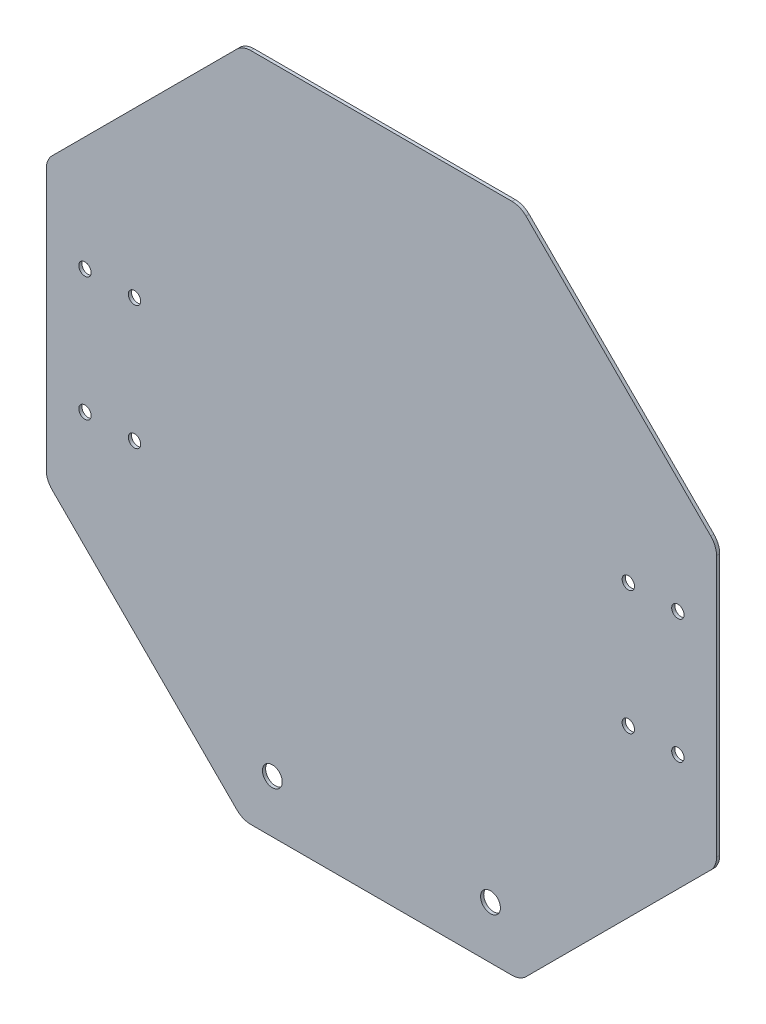
ISO-10303-21;
HEADER;
FILE_DESCRIPTION(('STEP AP214'),'2;1');
FILE_NAME('part.step','',(''),(''),'','','');
FILE_SCHEMA(('AUTOMOTIVE_DESIGN { 1 0 10303 214 1 1 1 1 }'));
ENDSEC;
DATA;
#1=APPLICATION_CONTEXT('core data for automotive mechanical design processes');
#2=APPLICATION_PROTOCOL_DEFINITION('international standard','automotive_design',2000,#1);
#3=PRODUCT_CONTEXT('',#1,'mechanical');
#4=PRODUCT('Part','Part','',(#3));
#5=PRODUCT_RELATED_PRODUCT_CATEGORY('part','',(#4));
#6=PRODUCT_DEFINITION_FORMATION('','',#4);
#7=PRODUCT_DEFINITION_CONTEXT('part definition',#1,'design');
#8=PRODUCT_DEFINITION('design','',#6,#7);
#9=PRODUCT_DEFINITION_SHAPE('','',#8);
#10=(LENGTH_UNIT() NAMED_UNIT(*) SI_UNIT(.MILLI.,.METRE.));
#11=(NAMED_UNIT(*) PLANE_ANGLE_UNIT() SI_UNIT($,.RADIAN.));
#12=(NAMED_UNIT(*) SI_UNIT($,.STERADIAN.) SOLID_ANGLE_UNIT());
#13=UNCERTAINTY_MEASURE_WITH_UNIT(LENGTH_MEASURE(1.E-05),#10,'distance_accuracy_value','');
#14=(GEOMETRIC_REPRESENTATION_CONTEXT(3) GLOBAL_UNCERTAINTY_ASSIGNED_CONTEXT((#13)) GLOBAL_UNIT_ASSIGNED_CONTEXT((#10,
#11,#12)) REPRESENTATION_CONTEXT('',''));
#15=CARTESIAN_POINT('',(0.,0.,0.));
#16=DIRECTION('',(0.,0.,1.));
#17=DIRECTION('',(1.,0.,0.));
#18=AXIS2_PLACEMENT_3D('',#15,#16,#17);
#19=CARTESIAN_POINT('',(96.8284371247499,78.2010199999873,0.36576));
#20=DIRECTION('',(0.,0.,-1.));
#21=DIRECTION('',(-1.,0.,0.));
#22=AXIS2_PLACEMENT_3D('',#19,#20,#21);
#23=CYLINDRICAL_SURFACE('',#22,2.);
#24=CARTESIAN_POINT('',(96.8284371247499,78.2010199999873,0.04572));
#25=DIRECTION('',(0.,0.,1.));
#26=DIRECTION('',(-1.,0.,0.));
#27=AXIS2_PLACEMENT_3D('',#24,#25,#26);
#28=CIRCLE('',#27,2.);
#29=CARTESIAN_POINT('',(95.41422,76.78681,0.04572));
#30=VERTEX_POINT('',#29);
#31=CARTESIAN_POINT('',(96.82843,76.20102,0.04572));
#32=VERTEX_POINT('',#31);
#33=EDGE_CURVE('E195',#30,#32,#28,.T.);
#34=ORIENTED_EDGE('',*,*,#33,.T.);
#35=DIRECTION('',(0.,0.,-1.));
#36=VECTOR('',#35,1.);
#37=CARTESIAN_POINT('',(96.82843,76.20102,0.36576));
#38=LINE('',#37,#36);
#39=CARTESIAN_POINT('',(96.82843,76.20102,0.36576));
#40=VERTEX_POINT('',#39);
#41=EDGE_CURVE('E11',#40,#32,#38,.T.);
#42=ORIENTED_EDGE('',*,*,#41,.F.);
#43=CARTESIAN_POINT('',(96.8284371247499,78.2010199999873,0.36576));
#44=DIRECTION('',(0.,0.,1.));
#45=DIRECTION('',(-1.,0.,0.));
#46=AXIS2_PLACEMENT_3D('',#43,#44,#45);
#47=CIRCLE('',#46,2.);
#48=CARTESIAN_POINT('',(95.41422,76.78681,0.36576));
#49=VERTEX_POINT('',#48);
#50=EDGE_CURVE('E242',#49,#40,#47,.T.);
#51=ORIENTED_EDGE('',*,*,#50,.F.);
#52=DIRECTION('',(0.,0.,-1.));
#53=VECTOR('',#52,1.);
#54=CARTESIAN_POINT('',(95.41422,76.78681,0.36576));
#55=LINE('',#54,#53);
#56=EDGE_CURVE('E191',#49,#30,#55,.T.);
#57=ORIENTED_EDGE('',*,*,#56,.T.);
#58=EDGE_LOOP('',(#34,#42,#51,#57));
#59=FACE_BOUND('',#58,.T.);
#60=ADVANCED_FACE('F46',(#59),#23,.T.);
#61=CARTESIAN_POINT('',(123.17158,76.20102,0.36576));
#62=DIRECTION('',(0.,1.,0.));
#63=DIRECTION('',(0.,0.,1.));
#64=AXIS2_PLACEMENT_3D('',#61,#62,#63);
#65=PLANE('',#64);
#66=DIRECTION('',(1.,0.,0.));
#67=VECTOR('',#66,1.);
#68=CARTESIAN_POINT('',(123.17158,76.20102,0.04572));
#69=LINE('',#68,#67);
#70=CARTESIAN_POINT('',(123.17158,76.20102,0.04572));
#71=VERTEX_POINT('',#70);
#72=EDGE_CURVE('E199',#32,#71,#69,.T.);
#73=ORIENTED_EDGE('',*,*,#72,.T.);
#74=DIRECTION('',(0.,0.,-1.));
#75=VECTOR('',#74,1.);
#76=CARTESIAN_POINT('',(123.17158,76.20102,0.36576));
#77=LINE('',#76,#75);
#78=CARTESIAN_POINT('',(123.17158,76.20102,0.36576));
#79=VERTEX_POINT('',#78);
#80=EDGE_CURVE('E55',#79,#71,#77,.T.);
#81=ORIENTED_EDGE('',*,*,#80,.F.);
#82=DIRECTION('',(1.,0.,0.));
#83=VECTOR('',#82,1.);
#84=CARTESIAN_POINT('',(123.17158,76.20102,0.36576));
#85=LINE('',#84,#83);
#86=EDGE_CURVE('E130',#40,#79,#85,.T.);
#87=ORIENTED_EDGE('',*,*,#86,.F.);
#88=ORIENTED_EDGE('',*,*,#41,.T.);
#89=EDGE_LOOP('',(#73,#81,#87,#88));
#90=FACE_BOUND('',#89,.T.);
#91=ADVANCED_FACE('F365',(#90),#65,.F.);
#92=CARTESIAN_POINT('',(123.171582875261,78.2010199999979,0.36576));
#93=DIRECTION('',(0.,0.,-1.));
#94=DIRECTION('',(-1.,0.,0.));
#95=AXIS2_PLACEMENT_3D('',#92,#93,#94);
#96=CYLINDRICAL_SURFACE('',#95,2.);
#97=CARTESIAN_POINT('',(123.171582875261,78.2010199999979,0.04572));
#98=DIRECTION('',(0.,0.,1.));
#99=DIRECTION('',(-1.,0.,0.));
#100=AXIS2_PLACEMENT_3D('',#97,#98,#99);
#101=CIRCLE('',#100,2.);
#102=CARTESIAN_POINT('',(124.5858,76.78681,0.04572));
#103=VERTEX_POINT('',#102);
#104=EDGE_CURVE('E203',#71,#103,#101,.T.);
#105=ORIENTED_EDGE('',*,*,#104,.T.);
#106=DIRECTION('',(0.,0.,-1.));
#107=VECTOR('',#106,1.);
#108=CARTESIAN_POINT('',(124.5858,76.78681,0.36576));
#109=LINE('',#108,#107);
#110=CARTESIAN_POINT('',(124.5858,76.78681,0.36576));
#111=VERTEX_POINT('',#110);
#112=EDGE_CURVE('E285',#111,#103,#109,.T.);
#113=ORIENTED_EDGE('',*,*,#112,.F.);
#114=CARTESIAN_POINT('',(123.171582875261,78.2010199999979,0.36576));
#115=DIRECTION('',(0.,0.,1.));
#116=DIRECTION('',(-1.,0.,0.));
#117=AXIS2_PLACEMENT_3D('',#114,#115,#116);
#118=CIRCLE('',#117,2.);
#119=EDGE_CURVE('E295',#79,#111,#118,.T.);
#120=ORIENTED_EDGE('',*,*,#119,.F.);
#121=ORIENTED_EDGE('',*,*,#80,.T.);
#122=EDGE_LOOP('',(#105,#113,#120,#121));
#123=FACE_BOUND('',#122,.T.);
#124=ADVANCED_FACE('F293',(#123),#96,.T.);
#125=CARTESIAN_POINT('',(143.21321,95.41422,0.36576));
#126=DIRECTION('',(-0.707106781186547,0.707106781186547,0.));
#127=DIRECTION('',(-0.707106781186548,-0.707106781186548,0.));
#128=AXIS2_PLACEMENT_3D('',#125,#126,#127);
#129=PLANE('',#128);
#130=DIRECTION('',(0.707106781186547,0.707106781186547,0.));
#131=VECTOR('',#130,1.);
#132=CARTESIAN_POINT('',(143.21321,95.41422,0.04572));
#133=LINE('',#132,#131);
#134=CARTESIAN_POINT('',(143.21321,95.41422,0.04572));
#135=VERTEX_POINT('',#134);
#136=EDGE_CURVE('E206',#103,#135,#133,.T.);
#137=ORIENTED_EDGE('',*,*,#136,.T.);
#138=DIRECTION('',(0.,0.,-1.));
#139=VECTOR('',#138,1.);
#140=CARTESIAN_POINT('',(143.21321,95.41422,0.36576));
#141=LINE('',#140,#139);
#142=CARTESIAN_POINT('',(143.21321,95.41422,0.36576));
#143=VERTEX_POINT('',#142);
#144=EDGE_CURVE('E281',#143,#135,#141,.T.);
#145=ORIENTED_EDGE('',*,*,#144,.F.);
#146=DIRECTION('',(0.707106781186547,0.707106781186547,0.));
#147=VECTOR('',#146,1.);
#148=CARTESIAN_POINT('',(143.21321,95.41422,0.36576));
#149=LINE('',#148,#147);
#150=EDGE_CURVE('E314',#111,#143,#149,.T.);
#151=ORIENTED_EDGE('',*,*,#150,.F.);
#152=ORIENTED_EDGE('',*,*,#112,.T.);
#153=EDGE_LOOP('',(#137,#145,#151,#152));
#154=FACE_BOUND('',#153,.T.);
#155=ADVANCED_FACE('F304',(#154),#129,.F.);
#156=CARTESIAN_POINT('',(141.799000000013,96.8284371247499,0.36576));
#157=DIRECTION('',(0.,0.,-1.));
#158=DIRECTION('',(-1.,0.,0.));
#159=AXIS2_PLACEMENT_3D('',#156,#157,#158);
#160=CYLINDRICAL_SURFACE('',#159,2.00000000000001);
#161=CARTESIAN_POINT('',(141.799000000013,96.8284371247499,0.04572));
#162=DIRECTION('',(0.,0.,1.));
#163=DIRECTION('',(-1.,0.,0.));
#164=AXIS2_PLACEMENT_3D('',#161,#162,#163);
#165=CIRCLE('',#164,2.00000000000001);
#166=CARTESIAN_POINT('',(143.799,96.82843,0.04572));
#167=VERTEX_POINT('',#166);
#168=EDGE_CURVE('E209',#135,#167,#165,.T.);
#169=ORIENTED_EDGE('',*,*,#168,.T.);
#170=DIRECTION('',(0.,0.,-1.));
#171=VECTOR('',#170,1.);
#172=CARTESIAN_POINT('',(143.799,96.82843,0.36576));
#173=LINE('',#172,#171);
#174=CARTESIAN_POINT('',(143.799,96.82843,0.36576));
#175=VERTEX_POINT('',#174);
#176=EDGE_CURVE('E277',#175,#167,#173,.T.);
#177=ORIENTED_EDGE('',*,*,#176,.F.);
#178=CARTESIAN_POINT('',(141.799000000013,96.8284371247499,0.36576));
#179=DIRECTION('',(0.,0.,1.));
#180=DIRECTION('',(-1.,0.,0.));
#181=AXIS2_PLACEMENT_3D('',#178,#179,#180);
#182=CIRCLE('',#181,2.00000000000001);
#183=EDGE_CURVE('E310',#143,#175,#182,.T.);
#184=ORIENTED_EDGE('',*,*,#183,.F.);
#185=ORIENTED_EDGE('',*,*,#144,.T.);
#186=EDGE_LOOP('',(#169,#177,#184,#185));
#187=FACE_BOUND('',#186,.T.);
#188=ADVANCED_FACE('F308',(#187),#160,.T.);
#189=CARTESIAN_POINT('',(143.799,123.17158,0.36576));
#190=DIRECTION('',(-1.,0.,0.));
#191=DIRECTION('',(0.,0.,1.));
#192=AXIS2_PLACEMENT_3D('',#189,#190,#191);
#193=PLANE('',#192);
#194=DIRECTION('',(0.,1.,0.));
#195=VECTOR('',#194,1.);
#196=CARTESIAN_POINT('',(143.799,123.17158,0.04572));
#197=LINE('',#196,#195);
#198=CARTESIAN_POINT('',(143.799,123.17158,0.04572));
#199=VERTEX_POINT('',#198);
#200=EDGE_CURVE('E212',#167,#199,#197,.T.);
#201=ORIENTED_EDGE('',*,*,#200,.T.);
#202=DIRECTION('',(0.,0.,-1.));
#203=VECTOR('',#202,1.);
#204=CARTESIAN_POINT('',(143.799,123.17158,0.36576));
#205=LINE('',#204,#203);
#206=CARTESIAN_POINT('',(143.799,123.17158,0.36576));
#207=VERTEX_POINT('',#206);
#208=EDGE_CURVE('E273',#207,#199,#205,.T.);
#209=ORIENTED_EDGE('',*,*,#208,.F.);
#210=DIRECTION('',(0.,1.,0.));
#211=VECTOR('',#210,1.);
#212=CARTESIAN_POINT('',(143.799,123.17158,0.36576));
#213=LINE('',#212,#211);
#214=EDGE_CURVE('E313',#175,#207,#213,.T.);
#215=ORIENTED_EDGE('',*,*,#214,.F.);
#216=ORIENTED_EDGE('',*,*,#176,.T.);
#217=EDGE_LOOP('',(#201,#209,#215,#216));
#218=FACE_BOUND('',#217,.T.);
#219=ADVANCED_FACE('F378',(#218),#193,.F.);
#220=CARTESIAN_POINT('',(141.799000000002,123.171582875261,0.36576));
#221=DIRECTION('',(0.,0.,-1.));
#222=DIRECTION('',(-1.,0.,0.));
#223=AXIS2_PLACEMENT_3D('',#220,#221,#222);
#224=CYLINDRICAL_SURFACE('',#223,2.00000000000001);
#225=CARTESIAN_POINT('',(141.799000000002,123.171582875261,0.04572));
#226=DIRECTION('',(0.,0.,1.));
#227=DIRECTION('',(-1.,0.,0.));
#228=AXIS2_PLACEMENT_3D('',#225,#226,#227);
#229=CIRCLE('',#228,2.00000000000001);
#230=CARTESIAN_POINT('',(143.21321,124.5858,0.04572));
#231=VERTEX_POINT('',#230);
#232=EDGE_CURVE('E215',#199,#231,#229,.T.);
#233=ORIENTED_EDGE('',*,*,#232,.T.);
#234=DIRECTION('',(0.,0.,-1.));
#235=VECTOR('',#234,1.);
#236=CARTESIAN_POINT('',(143.21321,124.5858,0.36576));
#237=LINE('',#236,#235);
#238=CARTESIAN_POINT('',(143.21321,124.5858,0.36576));
#239=VERTEX_POINT('',#238);
#240=EDGE_CURVE('E269',#239,#231,#237,.T.);
#241=ORIENTED_EDGE('',*,*,#240,.F.);
#242=CARTESIAN_POINT('',(141.799000000002,123.171582875261,0.36576));
#243=DIRECTION('',(0.,0.,1.));
#244=DIRECTION('',(-1.,0.,0.));
#245=AXIS2_PLACEMENT_3D('',#242,#243,#244);
#246=CIRCLE('',#245,2.00000000000001);
#247=EDGE_CURVE('E318',#207,#239,#246,.T.);
#248=ORIENTED_EDGE('',*,*,#247,.F.);
#249=ORIENTED_EDGE('',*,*,#208,.T.);
#250=EDGE_LOOP('',(#233,#241,#248,#249));
#251=FACE_BOUND('',#250,.T.);
#252=ADVANCED_FACE('F381',(#251),#224,.T.);
#253=CARTESIAN_POINT('',(124.5858,143.21321,0.36576));
#254=DIRECTION('',(-0.707106781186547,-0.707106781186547,0.));
#255=DIRECTION('',(0.707106781186548,-0.707106781186548,0.));
#256=AXIS2_PLACEMENT_3D('',#253,#254,#255);
#257=PLANE('',#256);
#258=DIRECTION('',(-0.707106781186547,0.707106781186547,0.));
#259=VECTOR('',#258,1.);
#260=CARTESIAN_POINT('',(124.5858,143.21321,0.04572));
#261=LINE('',#260,#259);
#262=CARTESIAN_POINT('',(124.5858,143.21321,0.04572));
#263=VERTEX_POINT('',#262);
#264=EDGE_CURVE('E218',#231,#263,#261,.T.);
#265=ORIENTED_EDGE('',*,*,#264,.T.);
#266=DIRECTION('',(0.,0.,-1.));
#267=VECTOR('',#266,1.);
#268=CARTESIAN_POINT('',(124.5858,143.21321,0.36576));
#269=LINE('',#268,#267);
#270=CARTESIAN_POINT('',(124.5858,143.21321,0.36576));
#271=VERTEX_POINT('',#270);
#272=EDGE_CURVE('E265',#271,#263,#269,.T.);
#273=ORIENTED_EDGE('',*,*,#272,.F.);
#274=DIRECTION('',(-0.707106781186547,0.707106781186547,0.));
#275=VECTOR('',#274,1.);
#276=CARTESIAN_POINT('',(124.5858,143.21321,0.36576));
#277=LINE('',#276,#275);
#278=EDGE_CURVE('E325',#239,#271,#277,.T.);
#279=ORIENTED_EDGE('',*,*,#278,.F.);
#280=ORIENTED_EDGE('',*,*,#240,.T.);
#281=EDGE_LOOP('',(#265,#273,#279,#280));
#282=FACE_BOUND('',#281,.T.);
#283=ADVANCED_FACE('F385',(#282),#257,.F.);
#284=CARTESIAN_POINT('',(123.171582875261,141.799000000002,0.36576));
#285=DIRECTION('',(0.,0.,-1.));
#286=DIRECTION('',(-1.,0.,0.));
#287=AXIS2_PLACEMENT_3D('',#284,#285,#286);
#288=CYLINDRICAL_SURFACE('',#287,2.00000000000001);
#289=CARTESIAN_POINT('',(123.171582875261,141.799000000002,0.04572));
#290=DIRECTION('',(0.,0.,1.));
#291=DIRECTION('',(-1.,0.,0.));
#292=AXIS2_PLACEMENT_3D('',#289,#290,#291);
#293=CIRCLE('',#292,2.00000000000001);
#294=CARTESIAN_POINT('',(123.17158,143.799,0.04572));
#295=VERTEX_POINT('',#294);
#296=EDGE_CURVE('E221',#263,#295,#293,.T.);
#297=ORIENTED_EDGE('',*,*,#296,.T.);
#298=DIRECTION('',(0.,0.,-1.));
#299=VECTOR('',#298,1.);
#300=CARTESIAN_POINT('',(123.17158,143.799,0.36576));
#301=LINE('',#300,#299);
#302=CARTESIAN_POINT('',(123.17158,143.799,0.36576));
#303=VERTEX_POINT('',#302);
#304=EDGE_CURVE('E261',#303,#295,#301,.T.);
#305=ORIENTED_EDGE('',*,*,#304,.F.);
#306=CARTESIAN_POINT('',(123.171582875261,141.799000000002,0.36576));
#307=DIRECTION('',(0.,0.,1.));
#308=DIRECTION('',(-1.,0.,0.));
#309=AXIS2_PLACEMENT_3D('',#306,#307,#308);
#310=CIRCLE('',#309,2.00000000000001);
#311=EDGE_CURVE('E328',#271,#303,#310,.T.);
#312=ORIENTED_EDGE('',*,*,#311,.F.);
#313=ORIENTED_EDGE('',*,*,#272,.T.);
#314=EDGE_LOOP('',(#297,#305,#312,#313));
#315=FACE_BOUND('',#314,.T.);
#316=ADVANCED_FACE('F389',(#315),#288,.T.);
#317=CARTESIAN_POINT('',(96.82843,143.799,0.36576));
#318=DIRECTION('',(0.,-1.,0.));
#319=DIRECTION('',(0.,0.,-1.));
#320=AXIS2_PLACEMENT_3D('',#317,#318,#319);
#321=PLANE('',#320);
#322=DIRECTION('',(-1.,0.,0.));
#323=VECTOR('',#322,1.);
#324=CARTESIAN_POINT('',(96.82843,143.799,0.04572));
#325=LINE('',#324,#323);
#326=CARTESIAN_POINT('',(96.82843,143.799,0.04572));
#327=VERTEX_POINT('',#326);
#328=EDGE_CURVE('E224',#295,#327,#325,.T.);
#329=ORIENTED_EDGE('',*,*,#328,.T.);
#330=DIRECTION('',(0.,0.,-1.));
#331=VECTOR('',#330,1.);
#332=CARTESIAN_POINT('',(96.82843,143.799,0.36576));
#333=LINE('',#332,#331);
#334=CARTESIAN_POINT('',(96.82843,143.799,0.36576));
#335=VERTEX_POINT('',#334);
#336=EDGE_CURVE('E257',#335,#327,#333,.T.);
#337=ORIENTED_EDGE('',*,*,#336,.F.);
#338=DIRECTION('',(-1.,0.,0.));
#339=VECTOR('',#338,1.);
#340=CARTESIAN_POINT('',(96.82843,143.799,0.36576));
#341=LINE('',#340,#339);
#342=EDGE_CURVE('E331',#303,#335,#341,.T.);
#343=ORIENTED_EDGE('',*,*,#342,.F.);
#344=ORIENTED_EDGE('',*,*,#304,.T.);
#345=EDGE_LOOP('',(#329,#337,#343,#344));
#346=FACE_BOUND('',#345,.T.);
#347=ADVANCED_FACE('F393',(#346),#321,.F.);
#348=CARTESIAN_POINT('',(96.8284371247499,141.799000000013,0.36576));
#349=DIRECTION('',(0.,0.,-1.));
#350=DIRECTION('',(-1.,0.,0.));
#351=AXIS2_PLACEMENT_3D('',#348,#349,#350);
#352=CYLINDRICAL_SURFACE('',#351,2.00000000000001);
#353=CARTESIAN_POINT('',(96.8284371247499,141.799000000013,0.04572));
#354=DIRECTION('',(0.,0.,1.));
#355=DIRECTION('',(-1.,0.,0.));
#356=AXIS2_PLACEMENT_3D('',#353,#354,#355);
#357=CIRCLE('',#356,2.00000000000001);
#358=CARTESIAN_POINT('',(95.41422,143.21321,0.04572));
#359=VERTEX_POINT('',#358);
#360=EDGE_CURVE('E227',#327,#359,#357,.T.);
#361=ORIENTED_EDGE('',*,*,#360,.T.);
#362=DIRECTION('',(0.,0.,-1.));
#363=VECTOR('',#362,1.);
#364=CARTESIAN_POINT('',(95.41422,143.21321,0.36576));
#365=LINE('',#364,#363);
#366=CARTESIAN_POINT('',(95.41422,143.21321,0.36576));
#367=VERTEX_POINT('',#366);
#368=EDGE_CURVE('E253',#367,#359,#365,.T.);
#369=ORIENTED_EDGE('',*,*,#368,.F.);
#370=CARTESIAN_POINT('',(96.8284371247499,141.799000000013,0.36576));
#371=DIRECTION('',(0.,0.,1.));
#372=DIRECTION('',(-1.,0.,0.));
#373=AXIS2_PLACEMENT_3D('',#370,#371,#372);
#374=CIRCLE('',#373,2.00000000000001);
#375=EDGE_CURVE('E334',#335,#367,#374,.T.);
#376=ORIENTED_EDGE('',*,*,#375,.F.);
#377=ORIENTED_EDGE('',*,*,#336,.T.);
#378=EDGE_LOOP('',(#361,#369,#376,#377));
#379=FACE_BOUND('',#378,.T.);
#380=ADVANCED_FACE('F397',(#379),#352,.T.);
#381=CARTESIAN_POINT('',(76.78681,124.5858,0.36576));
#382=DIRECTION('',(0.707106781186547,-0.707106781186547,0.));
#383=DIRECTION('',(0.707106781186548,0.707106781186548,0.));
#384=AXIS2_PLACEMENT_3D('',#381,#382,#383);
#385=PLANE('',#384);
#386=DIRECTION('',(-0.707106781186547,-0.707106781186547,0.));
#387=VECTOR('',#386,1.);
#388=CARTESIAN_POINT('',(76.78681,124.5858,0.04572));
#389=LINE('',#388,#387);
#390=CARTESIAN_POINT('',(76.78681,124.5858,0.04572));
#391=VERTEX_POINT('',#390);
#392=EDGE_CURVE('E230',#359,#391,#389,.T.);
#393=ORIENTED_EDGE('',*,*,#392,.T.);
#394=DIRECTION('',(0.,0.,-1.));
#395=VECTOR('',#394,1.);
#396=CARTESIAN_POINT('',(76.78681,124.5858,0.36576));
#397=LINE('',#396,#395);
#398=CARTESIAN_POINT('',(76.78681,124.5858,0.36576));
#399=VERTEX_POINT('',#398);
#400=EDGE_CURVE('E249',#399,#391,#397,.T.);
#401=ORIENTED_EDGE('',*,*,#400,.F.);
#402=DIRECTION('',(-0.707106781186547,-0.707106781186547,0.));
#403=VECTOR('',#402,1.);
#404=CARTESIAN_POINT('',(76.78681,124.5858,0.36576));
#405=LINE('',#404,#403);
#406=EDGE_CURVE('E337',#367,#399,#405,.T.);
#407=ORIENTED_EDGE('',*,*,#406,.F.);
#408=ORIENTED_EDGE('',*,*,#368,.T.);
#409=EDGE_LOOP('',(#393,#401,#407,#408));
#410=FACE_BOUND('',#409,.T.);
#411=ADVANCED_FACE('F345',(#410),#385,.F.);
#412=CARTESIAN_POINT('',(78.2010199999979,123.171582875261,0.36576));
#413=DIRECTION('',(0.,0.,-1.));
#414=DIRECTION('',(-1.,0.,0.));
#415=AXIS2_PLACEMENT_3D('',#412,#413,#414);
#416=CYLINDRICAL_SURFACE('',#415,2.);
#417=CARTESIAN_POINT('',(78.2010199999979,123.171582875261,0.04572));
#418=DIRECTION('',(0.,0.,1.));
#419=DIRECTION('',(-1.,0.,0.));
#420=AXIS2_PLACEMENT_3D('',#417,#418,#419);
#421=CIRCLE('',#420,2.);
#422=CARTESIAN_POINT('',(76.20102,123.17158,0.04572));
#423=VERTEX_POINT('',#422);
#424=EDGE_CURVE('E233',#391,#423,#421,.T.);
#425=ORIENTED_EDGE('',*,*,#424,.T.);
#426=DIRECTION('',(0.,0.,-1.));
#427=VECTOR('',#426,1.);
#428=CARTESIAN_POINT('',(76.20102,123.17158,0.36576));
#429=LINE('',#428,#427);
#430=CARTESIAN_POINT('',(76.20102,123.17158,0.36576));
#431=VERTEX_POINT('',#430);
#432=EDGE_CURVE('E184',#431,#423,#429,.T.);
#433=ORIENTED_EDGE('',*,*,#432,.F.);
#434=CARTESIAN_POINT('',(78.2010199999979,123.171582875261,0.36576));
#435=DIRECTION('',(0.,0.,1.));
#436=DIRECTION('',(-1.,0.,0.));
#437=AXIS2_PLACEMENT_3D('',#434,#435,#436);
#438=CIRCLE('',#437,2.);
#439=EDGE_CURVE('E173',#399,#431,#438,.T.);
#440=ORIENTED_EDGE('',*,*,#439,.F.);
#441=ORIENTED_EDGE('',*,*,#400,.T.);
#442=EDGE_LOOP('',(#425,#433,#440,#441));
#443=FACE_BOUND('',#442,.T.);
#444=ADVANCED_FACE('F349',(#443),#416,.T.);
#445=CARTESIAN_POINT('',(76.20102,96.82843,0.36576));
#446=DIRECTION('',(1.,0.,0.));
#447=DIRECTION('',(0.,0.,-1.));
#448=AXIS2_PLACEMENT_3D('',#445,#446,#447);
#449=PLANE('',#448);
#450=DIRECTION('',(0.,-1.,0.));
#451=VECTOR('',#450,1.);
#452=CARTESIAN_POINT('',(76.20102,96.82843,0.04572));
#453=LINE('',#452,#451);
#454=CARTESIAN_POINT('',(76.20102,96.82843,0.04572));
#455=VERTEX_POINT('',#454);
#456=EDGE_CURVE('E182',#423,#455,#453,.T.);
#457=ORIENTED_EDGE('',*,*,#456,.T.);
#458=DIRECTION('',(0.,0.,-1.));
#459=VECTOR('',#458,1.);
#460=CARTESIAN_POINT('',(76.20102,96.82843,0.36576));
#461=LINE('',#460,#459);
#462=CARTESIAN_POINT('',(76.20102,96.82843,0.36576));
#463=VERTEX_POINT('',#462);
#464=EDGE_CURVE('E179',#463,#455,#461,.T.);
#465=ORIENTED_EDGE('',*,*,#464,.F.);
#466=DIRECTION('',(0.,-1.,0.));
#467=VECTOR('',#466,1.);
#468=CARTESIAN_POINT('',(76.20102,96.82843,0.36576));
#469=LINE('',#468,#467);
#470=EDGE_CURVE('E167',#431,#463,#469,.T.);
#471=ORIENTED_EDGE('',*,*,#470,.F.);
#472=ORIENTED_EDGE('',*,*,#432,.T.);
#473=EDGE_LOOP('',(#457,#465,#471,#472));
#474=FACE_BOUND('',#473,.T.);
#475=ADVANCED_FACE('F180',(#474),#449,.F.);
#476=CARTESIAN_POINT('',(78.2010199999873,96.8284371247499,0.36576));
#477=DIRECTION('',(0.,0.,-1.));
#478=DIRECTION('',(-1.,0.,0.));
#479=AXIS2_PLACEMENT_3D('',#476,#477,#478);
#480=CYLINDRICAL_SURFACE('',#479,2.);
#481=CARTESIAN_POINT('',(78.2010199999873,96.8284371247499,0.04572));
#482=DIRECTION('',(0.,0.,1.));
#483=DIRECTION('',(-1.,0.,0.));
#484=AXIS2_PLACEMENT_3D('',#481,#482,#483);
#485=CIRCLE('',#484,2.);
#486=CARTESIAN_POINT('',(76.78681,95.41422,0.04572));
#487=VERTEX_POINT('',#486);
#488=EDGE_CURVE('E116',#455,#487,#485,.T.);
#489=ORIENTED_EDGE('',*,*,#488,.T.);
#490=DIRECTION('',(0.,0.,-1.));
#491=VECTOR('',#490,1.);
#492=CARTESIAN_POINT('',(76.78681,95.41422,0.36576));
#493=LINE('',#492,#491);
#494=CARTESIAN_POINT('',(76.78681,95.41422,0.36576));
#495=VERTEX_POINT('',#494);
#496=EDGE_CURVE('E185',#495,#487,#493,.T.);
#497=ORIENTED_EDGE('',*,*,#496,.F.);
#498=CARTESIAN_POINT('',(78.2010199999873,96.8284371247499,0.36576));
#499=DIRECTION('',(0.,0.,1.));
#500=DIRECTION('',(-1.,0.,0.));
#501=AXIS2_PLACEMENT_3D('',#498,#499,#500);
#502=CIRCLE('',#501,2.);
#503=EDGE_CURVE('E171',#463,#495,#502,.T.);
#504=ORIENTED_EDGE('',*,*,#503,.F.);
#505=ORIENTED_EDGE('',*,*,#464,.T.);
#506=EDGE_LOOP('',(#489,#497,#504,#505));
#507=FACE_BOUND('',#506,.T.);
#508=ADVANCED_FACE('F187',(#507),#480,.T.);
#509=CARTESIAN_POINT('',(95.41422,76.78681,0.36576));
#510=DIRECTION('',(0.707106781186547,0.707106781186547,0.));
#511=DIRECTION('',(-0.707106781186548,0.707106781186548,0.));
#512=AXIS2_PLACEMENT_3D('',#509,#510,#511);
#513=PLANE('',#512);
#514=DIRECTION('',(0.707106781186547,-0.707106781186547,0.));
#515=VECTOR('',#514,1.);
#516=CARTESIAN_POINT('',(95.41422,76.78681,0.04572));
#517=LINE('',#516,#515);
#518=EDGE_CURVE('E122',#487,#30,#517,.T.);
#519=ORIENTED_EDGE('',*,*,#518,.T.);
#520=ORIENTED_EDGE('',*,*,#56,.F.);
#521=DIRECTION('',(0.707106781186547,-0.707106781186547,0.));
#522=VECTOR('',#521,1.);
#523=CARTESIAN_POINT('',(95.41422,76.78681,0.36576));
#524=LINE('',#523,#522);
#525=EDGE_CURVE('E63',#495,#49,#524,.T.);
#526=ORIENTED_EDGE('',*,*,#525,.F.);
#527=ORIENTED_EDGE('',*,*,#496,.T.);
#528=EDGE_LOOP('',(#519,#520,#526,#527));
#529=FACE_BOUND('',#528,.T.);
#530=ADVANCED_FACE('F353',(#529),#513,.F.);
#531=CARTESIAN_POINT('',(96.8284371247499,78.2010199999873,0.36576));
#532=DIRECTION('',(0.,0.,-1.));
#533=DIRECTION('',(-1.,0.,0.));
#534=AXIS2_PLACEMENT_3D('',#531,#532,#533);
#535=PLANE('',#534);
#536=CARTESIAN_POINT('',(134.9,103.85,0.365759999999994));
#537=DIRECTION('',(0.,0.,-1.));
#538=DIRECTION('',(-1.,0.,0.));
#539=AXIS2_PLACEMENT_3D('',#536,#537,#538);
#540=CIRCLE('',#539,0.624999999999987);
#541=CARTESIAN_POINT('',(134.275,103.85,0.365759999999994));
#542=VERTEX_POINT('',#541);
#543=EDGE_CURVE('E730',#542,#542,#540,.T.);
#544=ORIENTED_EDGE('',*,*,#543,.T.);
#545=EDGE_LOOP('',(#544));
#546=FACE_BOUND('',#545,.T.);
#547=CARTESIAN_POINT('',(139.9,116.35,0.365759999999994));
#548=DIRECTION('',(0.,0.,-1.));
#549=DIRECTION('',(-1.,0.,0.));
#550=AXIS2_PLACEMENT_3D('',#547,#548,#549);
#551=CIRCLE('',#550,0.624999999999987);
#552=CARTESIAN_POINT('',(139.275,116.35,0.365759999999994));
#553=VERTEX_POINT('',#552);
#554=EDGE_CURVE('E743',#553,#553,#551,.T.);
#555=ORIENTED_EDGE('',*,*,#554,.T.);
#556=EDGE_LOOP('',(#555));
#557=FACE_BOUND('',#556,.T.);
#558=CARTESIAN_POINT('',(134.9,116.35,0.365759999999994));
#559=DIRECTION('',(0.,0.,-1.));
#560=DIRECTION('',(-1.,0.,0.));
#561=AXIS2_PLACEMENT_3D('',#558,#559,#560);
#562=CIRCLE('',#561,0.624999999999987);
#563=CARTESIAN_POINT('',(134.275,116.35,0.365759999999994));
#564=VERTEX_POINT('',#563);
#565=EDGE_CURVE('E751',#564,#564,#562,.T.);
#566=ORIENTED_EDGE('',*,*,#565,.T.);
#567=EDGE_LOOP('',(#566));
#568=FACE_BOUND('',#567,.T.);
#569=CARTESIAN_POINT('',(139.9,103.85,0.365759999999994));
#570=DIRECTION('',(0.,0.,-1.));
#571=DIRECTION('',(-1.,0.,0.));
#572=AXIS2_PLACEMENT_3D('',#569,#570,#571);
#573=CIRCLE('',#572,0.624999999999987);
#574=CARTESIAN_POINT('',(139.275,103.85,0.365759999999994));
#575=VERTEX_POINT('',#574);
#576=EDGE_CURVE('E759',#575,#575,#573,.T.);
#577=ORIENTED_EDGE('',*,*,#576,.T.);
#578=EDGE_LOOP('',(#577));
#579=FACE_BOUND('',#578,.T.);
#580=CARTESIAN_POINT('',(85.1,103.85,0.365759999999994));
#581=DIRECTION('',(0.,0.,-1.));
#582=DIRECTION('',(-1.,0.,0.));
#583=AXIS2_PLACEMENT_3D('',#580,#581,#582);
#584=CIRCLE('',#583,0.624999999999987);
#585=CARTESIAN_POINT('',(84.475,103.85,0.365759999999994));
#586=VERTEX_POINT('',#585);
#587=EDGE_CURVE('E767',#586,#586,#584,.T.);
#588=ORIENTED_EDGE('',*,*,#587,.T.);
#589=EDGE_LOOP('',(#588));
#590=FACE_BOUND('',#589,.T.);
#591=CARTESIAN_POINT('',(85.1,116.35,0.365759999999994));
#592=DIRECTION('',(0.,0.,-1.));
#593=DIRECTION('',(-1.,0.,0.));
#594=AXIS2_PLACEMENT_3D('',#591,#592,#593);
#595=CIRCLE('',#594,0.624999999999987);
#596=CARTESIAN_POINT('',(84.475,116.35,0.365759999999994));
#597=VERTEX_POINT('',#596);
#598=EDGE_CURVE('E775',#597,#597,#595,.T.);
#599=ORIENTED_EDGE('',*,*,#598,.T.);
#600=EDGE_LOOP('',(#599));
#601=FACE_BOUND('',#600,.T.);
#602=CARTESIAN_POINT('',(80.1,116.35,0.365759999999994));
#603=DIRECTION('',(0.,0.,-1.));
#604=DIRECTION('',(-1.,0.,0.));
#605=AXIS2_PLACEMENT_3D('',#602,#603,#604);
#606=CIRCLE('',#605,0.624999999999987);
#607=CARTESIAN_POINT('',(79.475,116.35,0.365759999999994));
#608=VERTEX_POINT('',#607);
#609=EDGE_CURVE('E783',#608,#608,#606,.T.);
#610=ORIENTED_EDGE('',*,*,#609,.T.);
#611=EDGE_LOOP('',(#610));
#612=FACE_BOUND('',#611,.T.);
#613=CARTESIAN_POINT('',(80.1,103.85,0.365759999999994));
#614=DIRECTION('',(0.,0.,-1.));
#615=DIRECTION('',(-1.,0.,0.));
#616=AXIS2_PLACEMENT_3D('',#613,#614,#615);
#617=CIRCLE('',#616,0.624999999999987);
#618=CARTESIAN_POINT('',(79.475,103.85,0.365759999999994));
#619=VERTEX_POINT('',#618);
#620=EDGE_CURVE('E791',#619,#619,#617,.T.);
#621=ORIENTED_EDGE('',*,*,#620,.T.);
#622=EDGE_LOOP('',(#621));
#623=FACE_BOUND('',#622,.T.);
#624=CARTESIAN_POINT('',(121.,81.5,0.365759999999994));
#625=DIRECTION('',(0.,0.,-1.));
#626=DIRECTION('',(-1.,0.,0.));
#627=AXIS2_PLACEMENT_3D('',#624,#625,#626);
#628=CIRCLE('',#627,0.999999999999987);
#629=CARTESIAN_POINT('',(120.,81.5,0.365759999999994));
#630=VERTEX_POINT('',#629);
#631=EDGE_CURVE('E799',#630,#630,#628,.T.);
#632=ORIENTED_EDGE('',*,*,#631,.T.);
#633=EDGE_LOOP('',(#632));
#634=FACE_BOUND('',#633,.T.);
#635=CARTESIAN_POINT('',(99.,81.5,0.365759999999994));
#636=DIRECTION('',(0.,0.,-1.));
#637=DIRECTION('',(-1.,0.,0.));
#638=AXIS2_PLACEMENT_3D('',#635,#636,#637);
#639=CIRCLE('',#638,0.999999999999987);
#640=CARTESIAN_POINT('',(98.,81.5,0.365759999999994));
#641=VERTEX_POINT('',#640);
#642=EDGE_CURVE('E200',#641,#641,#639,.T.);
#643=ORIENTED_EDGE('',*,*,#642,.T.);
#644=EDGE_LOOP('',(#643));
#645=FACE_BOUND('',#644,.T.);
#646=ORIENTED_EDGE('',*,*,#50,.T.);
#647=ORIENTED_EDGE('',*,*,#86,.T.);
#648=ORIENTED_EDGE('',*,*,#119,.T.);
#649=ORIENTED_EDGE('',*,*,#150,.T.);
#650=ORIENTED_EDGE('',*,*,#183,.T.);
#651=ORIENTED_EDGE('',*,*,#214,.T.);
#652=ORIENTED_EDGE('',*,*,#247,.T.);
#653=ORIENTED_EDGE('',*,*,#278,.T.);
#654=ORIENTED_EDGE('',*,*,#311,.T.);
#655=ORIENTED_EDGE('',*,*,#342,.T.);
#656=ORIENTED_EDGE('',*,*,#375,.T.);
#657=ORIENTED_EDGE('',*,*,#406,.T.);
#658=ORIENTED_EDGE('',*,*,#439,.T.);
#659=ORIENTED_EDGE('',*,*,#470,.T.);
#660=ORIENTED_EDGE('',*,*,#503,.T.);
#661=ORIENTED_EDGE('',*,*,#525,.T.);
#662=EDGE_LOOP('',(#646,#647,#648,#649,#650,#651,#652,#653,#654,#655,#656,#657,#658,#659,#660,#661));
#663=FACE_BOUND('',#662,.T.);
#664=ADVANCED_FACE('F169',(#546,#557,#568,#579,#590,#601,#612,#623,#634,#645,#663),#535,.F.);
#665=CARTESIAN_POINT('',(96.8284371247499,78.2010199999873,0.04572));
#666=DIRECTION('',(0.,0.,-1.));
#667=DIRECTION('',(-1.,0.,0.));
#668=AXIS2_PLACEMENT_3D('',#665,#666,#667);
#669=PLANE('',#668);
#670=CARTESIAN_POINT('',(134.9,103.85,0.0457199999999985));
#671=DIRECTION('',(0.,0.,-1.));
#672=DIRECTION('',(-1.,0.,0.));
#673=AXIS2_PLACEMENT_3D('',#670,#671,#672);
#674=CIRCLE('',#673,0.624999999999987);
#675=CARTESIAN_POINT('',(134.275,103.85,0.0457199999999985));
#676=VERTEX_POINT('',#675);
#677=EDGE_CURVE('E733',#676,#676,#674,.T.);
#678=ORIENTED_EDGE('',*,*,#677,.F.);
#679=EDGE_LOOP('',(#678));
#680=FACE_BOUND('',#679,.T.);
#681=CARTESIAN_POINT('',(139.9,116.35,0.0457199999999985));
#682=DIRECTION('',(0.,0.,-1.));
#683=DIRECTION('',(-1.,0.,0.));
#684=AXIS2_PLACEMENT_3D('',#681,#682,#683);
#685=CIRCLE('',#684,0.624999999999987);
#686=CARTESIAN_POINT('',(139.275,116.35,0.0457199999999985));
#687=VERTEX_POINT('',#686);
#688=EDGE_CURVE('E737',#687,#687,#685,.T.);
#689=ORIENTED_EDGE('',*,*,#688,.F.);
#690=EDGE_LOOP('',(#689));
#691=FACE_BOUND('',#690,.T.);
#692=CARTESIAN_POINT('',(134.9,116.35,0.0457199999999985));
#693=DIRECTION('',(0.,0.,-1.));
#694=DIRECTION('',(-1.,0.,0.));
#695=AXIS2_PLACEMENT_3D('',#692,#693,#694);
#696=CIRCLE('',#695,0.624999999999987);
#697=CARTESIAN_POINT('',(134.275,116.35,0.0457199999999985));
#698=VERTEX_POINT('',#697);
#699=EDGE_CURVE('E747',#698,#698,#696,.T.);
#700=ORIENTED_EDGE('',*,*,#699,.F.);
#701=EDGE_LOOP('',(#700));
#702=FACE_BOUND('',#701,.T.);
#703=CARTESIAN_POINT('',(139.9,103.85,0.0457199999999985));
#704=DIRECTION('',(0.,0.,-1.));
#705=DIRECTION('',(-1.,0.,0.));
#706=AXIS2_PLACEMENT_3D('',#703,#704,#705);
#707=CIRCLE('',#706,0.624999999999987);
#708=CARTESIAN_POINT('',(139.275,103.85,0.0457199999999985));
#709=VERTEX_POINT('',#708);
#710=EDGE_CURVE('E755',#709,#709,#707,.T.);
#711=ORIENTED_EDGE('',*,*,#710,.F.);
#712=EDGE_LOOP('',(#711));
#713=FACE_BOUND('',#712,.T.);
#714=CARTESIAN_POINT('',(85.1,103.85,0.0457199999999985));
#715=DIRECTION('',(0.,0.,-1.));
#716=DIRECTION('',(-1.,0.,0.));
#717=AXIS2_PLACEMENT_3D('',#714,#715,#716);
#718=CIRCLE('',#717,0.624999999999987);
#719=CARTESIAN_POINT('',(84.475,103.85,0.0457199999999985));
#720=VERTEX_POINT('',#719);
#721=EDGE_CURVE('E763',#720,#720,#718,.T.);
#722=ORIENTED_EDGE('',*,*,#721,.F.);
#723=EDGE_LOOP('',(#722));
#724=FACE_BOUND('',#723,.T.);
#725=CARTESIAN_POINT('',(85.1,116.35,0.0457199999999985));
#726=DIRECTION('',(0.,0.,-1.));
#727=DIRECTION('',(-1.,0.,0.));
#728=AXIS2_PLACEMENT_3D('',#725,#726,#727);
#729=CIRCLE('',#728,0.624999999999987);
#730=CARTESIAN_POINT('',(84.475,116.35,0.0457199999999985));
#731=VERTEX_POINT('',#730);
#732=EDGE_CURVE('E771',#731,#731,#729,.T.);
#733=ORIENTED_EDGE('',*,*,#732,.F.);
#734=EDGE_LOOP('',(#733));
#735=FACE_BOUND('',#734,.T.);
#736=CARTESIAN_POINT('',(80.1,116.35,0.0457199999999985));
#737=DIRECTION('',(0.,0.,-1.));
#738=DIRECTION('',(-1.,0.,0.));
#739=AXIS2_PLACEMENT_3D('',#736,#737,#738);
#740=CIRCLE('',#739,0.624999999999987);
#741=CARTESIAN_POINT('',(79.475,116.35,0.0457199999999985));
#742=VERTEX_POINT('',#741);
#743=EDGE_CURVE('E779',#742,#742,#740,.T.);
#744=ORIENTED_EDGE('',*,*,#743,.F.);
#745=EDGE_LOOP('',(#744));
#746=FACE_BOUND('',#745,.T.);
#747=CARTESIAN_POINT('',(80.1,103.85,0.0457199999999985));
#748=DIRECTION('',(0.,0.,-1.));
#749=DIRECTION('',(-1.,0.,0.));
#750=AXIS2_PLACEMENT_3D('',#747,#748,#749);
#751=CIRCLE('',#750,0.624999999999987);
#752=CARTESIAN_POINT('',(79.475,103.85,0.0457199999999985));
#753=VERTEX_POINT('',#752);
#754=EDGE_CURVE('E787',#753,#753,#751,.T.);
#755=ORIENTED_EDGE('',*,*,#754,.F.);
#756=EDGE_LOOP('',(#755));
#757=FACE_BOUND('',#756,.T.);
#758=CARTESIAN_POINT('',(121.,81.5,0.0457199999999986));
#759=DIRECTION('',(0.,0.,-1.));
#760=DIRECTION('',(-1.,0.,0.));
#761=AXIS2_PLACEMENT_3D('',#758,#759,#760);
#762=CIRCLE('',#761,0.999999999999987);
#763=CARTESIAN_POINT('',(120.,81.5,0.0457199999999986));
#764=VERTEX_POINT('',#763);
#765=EDGE_CURVE('E795',#764,#764,#762,.T.);
#766=ORIENTED_EDGE('',*,*,#765,.F.);
#767=EDGE_LOOP('',(#766));
#768=FACE_BOUND('',#767,.T.);
#769=CARTESIAN_POINT('',(99.,81.5,0.0457199999999986));
#770=DIRECTION('',(0.,0.,-1.));
#771=DIRECTION('',(-1.,0.,0.));
#772=AXIS2_PLACEMENT_3D('',#769,#770,#771);
#773=CIRCLE('',#772,0.999999999999987);
#774=CARTESIAN_POINT('',(98.,81.5,0.0457199999999986));
#775=VERTEX_POINT('',#774);
#776=EDGE_CURVE('E803',#775,#775,#773,.T.);
#777=ORIENTED_EDGE('',*,*,#776,.F.);
#778=EDGE_LOOP('',(#777));
#779=FACE_BOUND('',#778,.T.);
#780=ORIENTED_EDGE('',*,*,#33,.F.);
#781=ORIENTED_EDGE('',*,*,#518,.F.);
#782=ORIENTED_EDGE('',*,*,#488,.F.);
#783=ORIENTED_EDGE('',*,*,#456,.F.);
#784=ORIENTED_EDGE('',*,*,#424,.F.);
#785=ORIENTED_EDGE('',*,*,#392,.F.);
#786=ORIENTED_EDGE('',*,*,#360,.F.);
#787=ORIENTED_EDGE('',*,*,#328,.F.);
#788=ORIENTED_EDGE('',*,*,#296,.F.);
#789=ORIENTED_EDGE('',*,*,#264,.F.);
#790=ORIENTED_EDGE('',*,*,#232,.F.);
#791=ORIENTED_EDGE('',*,*,#200,.F.);
#792=ORIENTED_EDGE('',*,*,#168,.F.);
#793=ORIENTED_EDGE('',*,*,#136,.F.);
#794=ORIENTED_EDGE('',*,*,#104,.F.);
#795=ORIENTED_EDGE('',*,*,#72,.F.);
#796=EDGE_LOOP('',(#780,#781,#782,#783,#784,#785,#786,#787,#788,#789,#790,#791,#792,#793,#794,#795));
#797=FACE_BOUND('',#796,.T.);
#798=ADVANCED_FACE('F299',(#680,#691,#702,#713,#724,#735,#746,#757,#768,#779,#797),#669,.T.);
#799=CARTESIAN_POINT('',(99.,81.5,0.04572));
#800=DIRECTION('',(0.,0.,-1.));
#801=DIRECTION('',(-1.,0.,0.));
#802=AXIS2_PLACEMENT_3D('',#799,#800,#801);
#803=CYLINDRICAL_SURFACE('',#802,0.999999999999987);
#804=ORIENTED_EDGE('',*,*,#642,.F.);
#805=EDGE_LOOP('',(#804));
#806=FACE_BOUND('',#805,.T.);
#807=ORIENTED_EDGE('',*,*,#776,.T.);
#808=EDGE_LOOP('',(#807));
#809=FACE_BOUND('',#808,.T.);
#810=ADVANCED_FACE('F436',(#806,#809),#803,.F.);
#811=CARTESIAN_POINT('',(121.,81.5,0.04572));
#812=DIRECTION('',(0.,0.,-1.));
#813=DIRECTION('',(-1.,0.,0.));
#814=AXIS2_PLACEMENT_3D('',#811,#812,#813);
#815=CYLINDRICAL_SURFACE('',#814,0.999999999999987);
#816=ORIENTED_EDGE('',*,*,#631,.F.);
#817=EDGE_LOOP('',(#816));
#818=FACE_BOUND('',#817,.T.);
#819=ORIENTED_EDGE('',*,*,#765,.T.);
#820=EDGE_LOOP('',(#819));
#821=FACE_BOUND('',#820,.T.);
#822=ADVANCED_FACE('F445',(#818,#821),#815,.F.);
#823=CARTESIAN_POINT('',(80.1,103.85,0.04572));
#824=DIRECTION('',(0.,0.,-1.));
#825=DIRECTION('',(-1.,0.,0.));
#826=AXIS2_PLACEMENT_3D('',#823,#824,#825);
#827=CYLINDRICAL_SURFACE('',#826,0.624999999999987);
#828=ORIENTED_EDGE('',*,*,#620,.F.);
#829=EDGE_LOOP('',(#828));
#830=FACE_BOUND('',#829,.T.);
#831=ORIENTED_EDGE('',*,*,#754,.T.);
#832=EDGE_LOOP('',(#831));
#833=FACE_BOUND('',#832,.T.);
#834=ADVANCED_FACE('F455',(#830,#833),#827,.F.);
#835=CARTESIAN_POINT('',(80.1,116.35,0.04572));
#836=DIRECTION('',(0.,0.,-1.));
#837=DIRECTION('',(-1.,0.,0.));
#838=AXIS2_PLACEMENT_3D('',#835,#836,#837);
#839=CYLINDRICAL_SURFACE('',#838,0.624999999999987);
#840=ORIENTED_EDGE('',*,*,#609,.F.);
#841=EDGE_LOOP('',(#840));
#842=FACE_BOUND('',#841,.T.);
#843=ORIENTED_EDGE('',*,*,#743,.T.);
#844=EDGE_LOOP('',(#843));
#845=FACE_BOUND('',#844,.T.);
#846=ADVANCED_FACE('F465',(#842,#845),#839,.F.);
#847=CARTESIAN_POINT('',(85.1,116.35,0.04572));
#848=DIRECTION('',(0.,0.,-1.));
#849=DIRECTION('',(-1.,0.,0.));
#850=AXIS2_PLACEMENT_3D('',#847,#848,#849);
#851=CYLINDRICAL_SURFACE('',#850,0.624999999999987);
#852=ORIENTED_EDGE('',*,*,#598,.F.);
#853=EDGE_LOOP('',(#852));
#854=FACE_BOUND('',#853,.T.);
#855=ORIENTED_EDGE('',*,*,#732,.T.);
#856=EDGE_LOOP('',(#855));
#857=FACE_BOUND('',#856,.T.);
#858=ADVANCED_FACE('F475',(#854,#857),#851,.F.);
#859=CARTESIAN_POINT('',(85.1,103.85,0.04572));
#860=DIRECTION('',(0.,0.,-1.));
#861=DIRECTION('',(-1.,0.,0.));
#862=AXIS2_PLACEMENT_3D('',#859,#860,#861);
#863=CYLINDRICAL_SURFACE('',#862,0.624999999999987);
#864=ORIENTED_EDGE('',*,*,#587,.F.);
#865=EDGE_LOOP('',(#864));
#866=FACE_BOUND('',#865,.T.);
#867=ORIENTED_EDGE('',*,*,#721,.T.);
#868=EDGE_LOOP('',(#867));
#869=FACE_BOUND('',#868,.T.);
#870=ADVANCED_FACE('F485',(#866,#869),#863,.F.);
#871=CARTESIAN_POINT('',(139.9,103.85,0.04572));
#872=DIRECTION('',(0.,0.,-1.));
#873=DIRECTION('',(-1.,0.,0.));
#874=AXIS2_PLACEMENT_3D('',#871,#872,#873);
#875=CYLINDRICAL_SURFACE('',#874,0.624999999999987);
#876=ORIENTED_EDGE('',*,*,#576,.F.);
#877=EDGE_LOOP('',(#876));
#878=FACE_BOUND('',#877,.T.);
#879=ORIENTED_EDGE('',*,*,#710,.T.);
#880=EDGE_LOOP('',(#879));
#881=FACE_BOUND('',#880,.T.);
#882=ADVANCED_FACE('F494',(#878,#881),#875,.F.);
#883=CARTESIAN_POINT('',(134.9,116.35,0.04572));
#884=DIRECTION('',(0.,0.,-1.));
#885=DIRECTION('',(-1.,0.,0.));
#886=AXIS2_PLACEMENT_3D('',#883,#884,#885);
#887=CYLINDRICAL_SURFACE('',#886,0.624999999999987);
#888=ORIENTED_EDGE('',*,*,#565,.F.);
#889=EDGE_LOOP('',(#888));
#890=FACE_BOUND('',#889,.T.);
#891=ORIENTED_EDGE('',*,*,#699,.T.);
#892=EDGE_LOOP('',(#891));
#893=FACE_BOUND('',#892,.T.);
#894=ADVANCED_FACE('F503',(#890,#893),#887,.F.);
#895=CARTESIAN_POINT('',(139.9,116.35,0.04572));
#896=DIRECTION('',(0.,0.,-1.));
#897=DIRECTION('',(-1.,0.,0.));
#898=AXIS2_PLACEMENT_3D('',#895,#896,#897);
#899=CYLINDRICAL_SURFACE('',#898,0.624999999999987);
#900=ORIENTED_EDGE('',*,*,#554,.F.);
#901=EDGE_LOOP('',(#900));
#902=FACE_BOUND('',#901,.T.);
#903=ORIENTED_EDGE('',*,*,#688,.T.);
#904=EDGE_LOOP('',(#903));
#905=FACE_BOUND('',#904,.T.);
#906=ADVANCED_FACE('F513',(#902,#905),#899,.F.);
#907=CARTESIAN_POINT('',(134.9,103.85,0.04572));
#908=DIRECTION('',(0.,0.,-1.));
#909=DIRECTION('',(-1.,0.,0.));
#910=AXIS2_PLACEMENT_3D('',#907,#908,#909);
#911=CYLINDRICAL_SURFACE('',#910,0.624999999999987);
#912=ORIENTED_EDGE('',*,*,#543,.F.);
#913=EDGE_LOOP('',(#912));
#914=FACE_BOUND('',#913,.T.);
#915=ORIENTED_EDGE('',*,*,#677,.T.);
#916=EDGE_LOOP('',(#915));
#917=FACE_BOUND('',#916,.T.);
#918=ADVANCED_FACE('F523',(#914,#917),#911,.F.);
#919=CLOSED_SHELL('',(#60,#91,#124,#155,#188,#219,#252,#283,#316,#347,#380,#411,#444,#475,#508,
#530,#664,#798,#810,#822,#834,#846,#858,#870,#882,#894,#906,#918));
#920=MANIFOLD_SOLID_BREP('B2',#919);
#921=ADVANCED_BREP_SHAPE_REPRESENTATION('',(#18,#920),#14);
#922=SHAPE_DEFINITION_REPRESENTATION(#9,#921);
ENDSEC;
END-ISO-10303-21;
